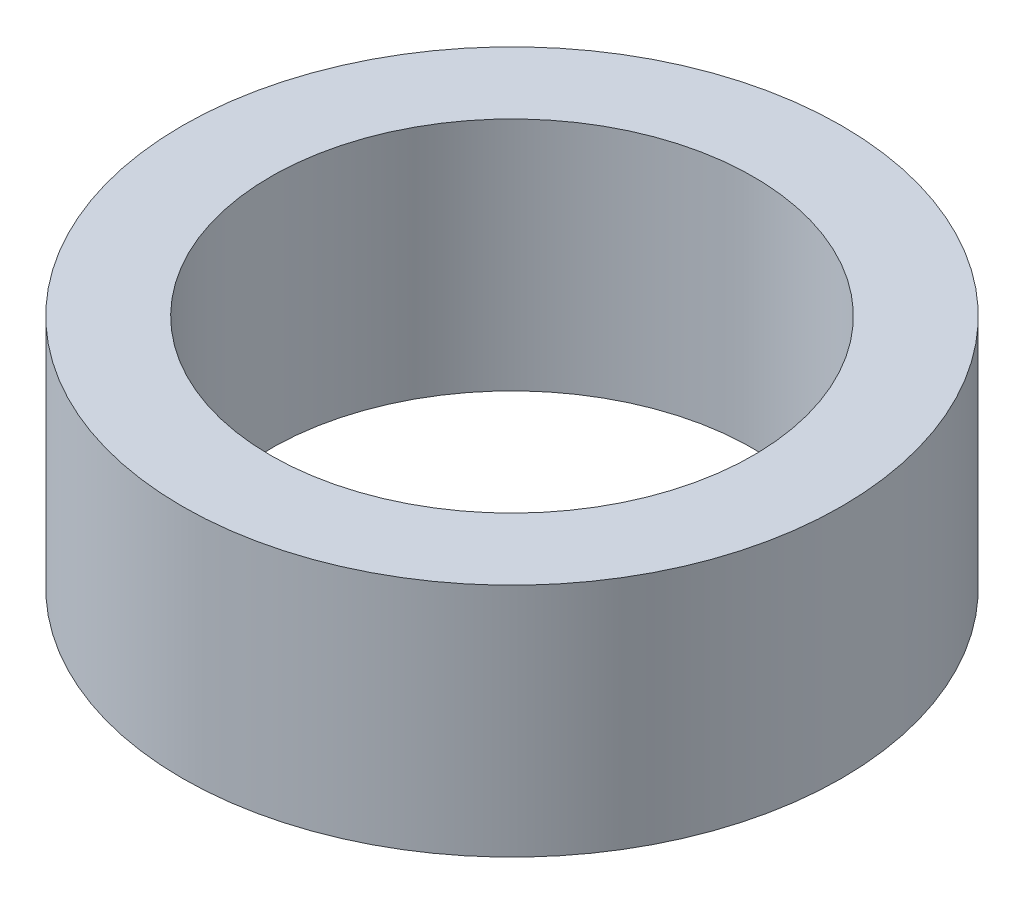
ISO-10303-21;
HEADER;
FILE_DESCRIPTION(('STEP AP214'),'2;1');
FILE_NAME('part.step','',(''),(''),'','','');
FILE_SCHEMA(('AUTOMOTIVE_DESIGN { 1 0 10303 214 1 1 1 1 }'));
ENDSEC;
DATA;
#1=APPLICATION_CONTEXT('core data for automotive mechanical design processes');
#2=APPLICATION_PROTOCOL_DEFINITION('international standard','automotive_design',2000,#1);
#3=PRODUCT_CONTEXT('',#1,'mechanical');
#4=PRODUCT('Part','Part','',(#3));
#5=PRODUCT_RELATED_PRODUCT_CATEGORY('part','',(#4));
#6=PRODUCT_DEFINITION_FORMATION('','',#4);
#7=PRODUCT_DEFINITION_CONTEXT('part definition',#1,'design');
#8=PRODUCT_DEFINITION('design','',#6,#7);
#9=PRODUCT_DEFINITION_SHAPE('','',#8);
#10=(LENGTH_UNIT() NAMED_UNIT(*) SI_UNIT(.MILLI.,.METRE.));
#11=(NAMED_UNIT(*) PLANE_ANGLE_UNIT() SI_UNIT($,.RADIAN.));
#12=(NAMED_UNIT(*) SI_UNIT($,.STERADIAN.) SOLID_ANGLE_UNIT());
#13=UNCERTAINTY_MEASURE_WITH_UNIT(LENGTH_MEASURE(1.E-05),#10,'distance_accuracy_value','');
#14=(GEOMETRIC_REPRESENTATION_CONTEXT(3) GLOBAL_UNCERTAINTY_ASSIGNED_CONTEXT((#13)) GLOBAL_UNIT_ASSIGNED_CONTEXT((#10,
#11,#12)) REPRESENTATION_CONTEXT('',''));
#15=CARTESIAN_POINT('',(0.,0.,0.));
#16=DIRECTION('',(0.,0.,1.));
#17=DIRECTION('',(1.,0.,0.));
#18=AXIS2_PLACEMENT_3D('',#15,#16,#17);
#19=CARTESIAN_POINT('',(0.,4.,0.));
#20=DIRECTION('',(0.,1.,0.));
#21=DIRECTION('',(0.,0.,1.));
#22=AXIS2_PLACEMENT_3D('',#19,#20,#21);
#23=PLANE('',#22);
#24=CARTESIAN_POINT('',(0.,4.,0.));
#25=DIRECTION('',(0.,1.,0.));
#26=DIRECTION('',(0.,0.,1.));
#27=AXIS2_PLACEMENT_3D('',#24,#25,#26);
#28=CIRCLE('',#27,5.6);
#29=CARTESIAN_POINT('',(0.,4.,5.6));
#30=VERTEX_POINT('',#29);
#31=EDGE_CURVE('E10',#30,#30,#28,.T.);
#32=ORIENTED_EDGE('',*,*,#31,.T.);
#33=EDGE_LOOP('',(#32));
#34=FACE_BOUND('',#33,.T.);
#35=CARTESIAN_POINT('',(0.,4.,0.));
#36=DIRECTION('',(0.,1.,0.));
#37=DIRECTION('',(0.,0.,1.));
#38=AXIS2_PLACEMENT_3D('',#35,#36,#37);
#39=CIRCLE('',#38,4.1);
#40=CARTESIAN_POINT('',(0.,4.,4.1));
#41=VERTEX_POINT('',#40);
#42=EDGE_CURVE('E49',#41,#41,#39,.T.);
#43=ORIENTED_EDGE('',*,*,#42,.F.);
#44=EDGE_LOOP('',(#43));
#45=FACE_BOUND('',#44,.T.);
#46=ADVANCED_FACE('F38',(#34,#45),#23,.T.);
#47=CARTESIAN_POINT('',(0.,0.,0.));
#48=DIRECTION('',(0.,1.,0.));
#49=DIRECTION('',(0.,0.,1.));
#50=AXIS2_PLACEMENT_3D('',#47,#48,#49);
#51=PLANE('',#50);
#52=CARTESIAN_POINT('',(0.,0.,0.));
#53=DIRECTION('',(0.,1.,0.));
#54=DIRECTION('',(0.,0.,1.));
#55=AXIS2_PLACEMENT_3D('',#52,#53,#54);
#56=CIRCLE('',#55,5.6);
#57=CARTESIAN_POINT('',(0.,0.,5.6));
#58=VERTEX_POINT('',#57);
#59=EDGE_CURVE('E42',#58,#58,#56,.T.);
#60=ORIENTED_EDGE('',*,*,#59,.F.);
#61=EDGE_LOOP('',(#60));
#62=FACE_BOUND('',#61,.T.);
#63=CARTESIAN_POINT('',(0.,0.,0.));
#64=DIRECTION('',(0.,1.,0.));
#65=DIRECTION('',(0.,0.,1.));
#66=AXIS2_PLACEMENT_3D('',#63,#64,#65);
#67=CIRCLE('',#66,4.1);
#68=CARTESIAN_POINT('',(0.,0.,4.1));
#69=VERTEX_POINT('',#68);
#70=EDGE_CURVE('E51',#69,#69,#67,.T.);
#71=ORIENTED_EDGE('',*,*,#70,.T.);
#72=EDGE_LOOP('',(#71));
#73=FACE_BOUND('',#72,.T.);
#74=ADVANCED_FACE('F61',(#62,#73),#51,.F.);
#75=CARTESIAN_POINT('',(0.,4.,0.));
#76=DIRECTION('',(0.,-1.,0.));
#77=DIRECTION('',(0.,0.,-1.));
#78=AXIS2_PLACEMENT_3D('',#75,#76,#77);
#79=CYLINDRICAL_SURFACE('',#78,5.6);
#80=ORIENTED_EDGE('',*,*,#31,.F.);
#81=EDGE_LOOP('',(#80));
#82=FACE_BOUND('',#81,.T.);
#83=ORIENTED_EDGE('',*,*,#59,.T.);
#84=EDGE_LOOP('',(#83));
#85=FACE_BOUND('',#84,.T.);
#86=ADVANCED_FACE('F40',(#82,#85),#79,.T.);
#87=CARTESIAN_POINT('',(0.,4.,0.));
#88=DIRECTION('',(0.,-1.,0.));
#89=DIRECTION('',(0.,0.,-1.));
#90=AXIS2_PLACEMENT_3D('',#87,#88,#89);
#91=CYLINDRICAL_SURFACE('',#90,4.1);
#92=ORIENTED_EDGE('',*,*,#42,.T.);
#93=EDGE_LOOP('',(#92));
#94=FACE_BOUND('',#93,.T.);
#95=ORIENTED_EDGE('',*,*,#70,.F.);
#96=EDGE_LOOP('',(#95));
#97=FACE_BOUND('',#96,.T.);
#98=ADVANCED_FACE('F57',(#94,#97),#91,.F.);
#99=CLOSED_SHELL('',(#46,#74,#86,#98));
#100=MANIFOLD_SOLID_BREP('B2',#99);
#101=ADVANCED_BREP_SHAPE_REPRESENTATION('',(#18,#100),#14);
#102=SHAPE_DEFINITION_REPRESENTATION(#9,#101);
ENDSEC;
END-ISO-10303-21;
